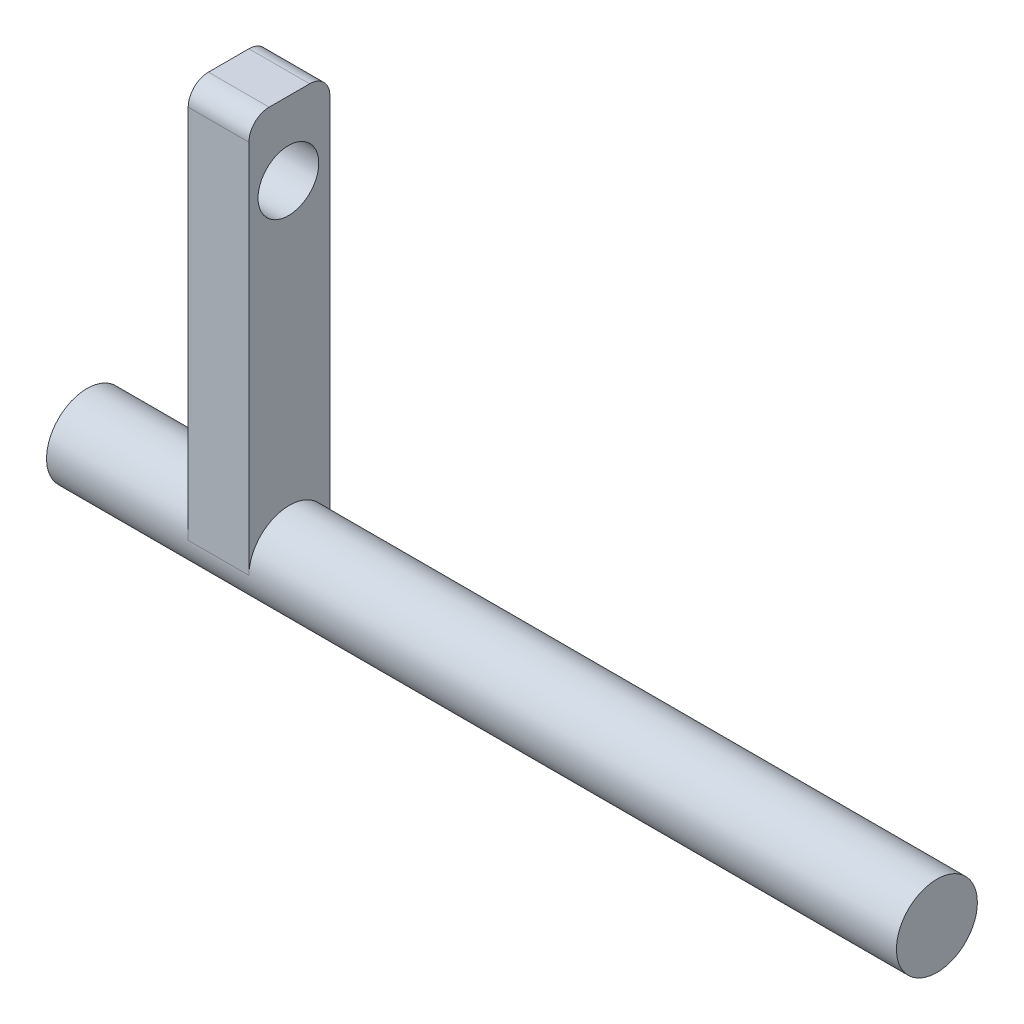
ISO-10303-21;
HEADER;
FILE_DESCRIPTION(('STEP AP214'),'2;1');
FILE_NAME('part.step','',(''),(''),'','','');
FILE_SCHEMA(('AUTOMOTIVE_DESIGN { 1 0 10303 214 1 1 1 1 }'));
ENDSEC;
DATA;
#1=APPLICATION_CONTEXT('core data for automotive mechanical design processes');
#2=APPLICATION_PROTOCOL_DEFINITION('international standard','automotive_design',2000,#1);
#3=PRODUCT_CONTEXT('',#1,'mechanical');
#4=PRODUCT('Part','Part','',(#3));
#5=PRODUCT_RELATED_PRODUCT_CATEGORY('part','',(#4));
#6=PRODUCT_DEFINITION_FORMATION('','',#4);
#7=PRODUCT_DEFINITION_CONTEXT('part definition',#1,'design');
#8=PRODUCT_DEFINITION('design','',#6,#7);
#9=PRODUCT_DEFINITION_SHAPE('','',#8);
#10=(LENGTH_UNIT() NAMED_UNIT(*) SI_UNIT(.MILLI.,.METRE.));
#11=(NAMED_UNIT(*) PLANE_ANGLE_UNIT() SI_UNIT($,.RADIAN.));
#12=(NAMED_UNIT(*) SI_UNIT($,.STERADIAN.) SOLID_ANGLE_UNIT());
#13=UNCERTAINTY_MEASURE_WITH_UNIT(LENGTH_MEASURE(1.E-05),#10,'distance_accuracy_value','');
#14=(GEOMETRIC_REPRESENTATION_CONTEXT(3) GLOBAL_UNCERTAINTY_ASSIGNED_CONTEXT((#13)) GLOBAL_UNIT_ASSIGNED_CONTEXT((#10,
#11,#12)) REPRESENTATION_CONTEXT('',''));
#15=CARTESIAN_POINT('',(0.,0.,0.));
#16=DIRECTION('',(0.,0.,1.));
#17=DIRECTION('',(1.,0.,0.));
#18=AXIS2_PLACEMENT_3D('',#15,#16,#17);
#19=CARTESIAN_POINT('',(10.,7.00051490063158,10.6584652997722));
#20=DIRECTION('',(0.,0.,-1.));
#21=DIRECTION('',(-1.,0.,0.));
#22=AXIS2_PLACEMENT_3D('',#19,#20,#21);
#23=PLANE('',#22);
#24=DIRECTION('',(0.,-1.,0.));
#25=VECTOR('',#24,1.);
#26=CARTESIAN_POINT('',(7.,7.00051490063158,10.6584652997722));
#27=LINE('',#26,#25);
#28=CARTESIAN_POINT('',(7.,25.5383100982032,10.6584652997722));
#29=VERTEX_POINT('',#28);
#30=CARTESIAN_POINT('',(7.,7.00051490063158,10.6584652997722));
#31=VERTEX_POINT('',#30);
#32=EDGE_CURVE('E88',#29,#31,#27,.T.);
#33=ORIENTED_EDGE('',*,*,#32,.F.);
#34=DIRECTION('',(-1.,0.,0.));
#35=VECTOR('',#34,1.);
#36=CARTESIAN_POINT('',(10.,25.5383100982032,10.6584652997722));
#37=LINE('',#36,#35);
#38=CARTESIAN_POINT('',(10.,25.5383100982032,10.6584652997722));
#39=VERTEX_POINT('',#38);
#40=EDGE_CURVE('E48',#29,#39,#37,.F.);
#41=ORIENTED_EDGE('',*,*,#40,.T.);
#42=DIRECTION('',(0.,-1.,0.));
#43=VECTOR('',#42,1.);
#44=CARTESIAN_POINT('',(10.,7.00051490063158,10.6584652997722));
#45=LINE('',#44,#43);
#46=CARTESIAN_POINT('',(10.,7.00051490063158,10.6584652997722));
#47=VERTEX_POINT('',#46);
#48=EDGE_CURVE('E109',#39,#47,#45,.T.);
#49=ORIENTED_EDGE('',*,*,#48,.T.);
#50=DIRECTION('',(-1.,0.,0.));
#51=VECTOR('',#50,1.);
#52=CARTESIAN_POINT('',(10.,7.00051490063158,10.6584652997722));
#53=LINE('',#52,#51);
#54=EDGE_CURVE('E103',#47,#31,#53,.T.);
#55=ORIENTED_EDGE('',*,*,#54,.T.);
#56=EDGE_LOOP('',(#33,#41,#49,#55));
#57=FACE_BOUND('',#56,.T.);
#58=ADVANCED_FACE('F40',(#57),#23,.T.);
#59=CARTESIAN_POINT('',(10.,13.7604693074356,14.6584652997722));
#60=DIRECTION('',(0.,0.,1.));
#61=DIRECTION('',(1.,0.,0.));
#62=AXIS2_PLACEMENT_3D('',#59,#60,#61);
#63=PLANE('',#62);
#64=DIRECTION('',(0.,1.,0.));
#65=VECTOR('',#64,1.);
#66=CARTESIAN_POINT('',(10.,13.7604693074356,14.6584652997722));
#67=LINE('',#66,#65);
#68=CARTESIAN_POINT('',(10.,7.00051490063158,14.6584652997722));
#69=VERTEX_POINT('',#68);
#70=CARTESIAN_POINT('',(10.,25.5383100982032,14.6584652997722));
#71=VERTEX_POINT('',#70);
#72=EDGE_CURVE('E96',#69,#71,#67,.T.);
#73=ORIENTED_EDGE('',*,*,#72,.T.);
#74=DIRECTION('',(1.,0.,0.));
#75=VECTOR('',#74,1.);
#76=CARTESIAN_POINT('',(7.,25.5383100982032,14.6584652997722));
#77=LINE('',#76,#75);
#78=CARTESIAN_POINT('',(7.,25.5383100982032,14.6584652997722));
#79=VERTEX_POINT('',#78);
#80=EDGE_CURVE('E128',#71,#79,#77,.F.);
#81=ORIENTED_EDGE('',*,*,#80,.T.);
#82=DIRECTION('',(0.,1.,0.));
#83=VECTOR('',#82,1.);
#84=CARTESIAN_POINT('',(7.,13.7604693074356,14.6584652997722));
#85=LINE('',#84,#83);
#86=CARTESIAN_POINT('',(7.,7.00051490063158,14.6584652997722));
#87=VERTEX_POINT('',#86);
#88=EDGE_CURVE('E97',#87,#79,#85,.T.);
#89=ORIENTED_EDGE('',*,*,#88,.F.);
#90=DIRECTION('',(-1.,0.,0.));
#91=VECTOR('',#90,1.);
#92=CARTESIAN_POINT('',(10.,7.00051490063158,14.6584652997722));
#93=LINE('',#92,#91);
#94=EDGE_CURVE('E106',#69,#87,#93,.T.);
#95=ORIENTED_EDGE('',*,*,#94,.F.);
#96=EDGE_LOOP('',(#73,#81,#89,#95));
#97=FACE_BOUND('',#96,.T.);
#98=ADVANCED_FACE('F158',(#97),#63,.T.);
#99=CARTESIAN_POINT('',(42.,7.00051490063158,12.6584652997722));
#100=DIRECTION('',(-1.,0.,0.));
#101=DIRECTION('',(0.,0.,1.));
#102=AXIS2_PLACEMENT_3D('',#99,#100,#101);
#103=CYLINDRICAL_SURFACE('',#102,2.);
#104=CARTESIAN_POINT('',(0.,7.00051490063158,12.6584652997722));
#105=DIRECTION('',(1.,0.,0.));
#106=DIRECTION('',(0.,0.,-1.));
#107=AXIS2_PLACEMENT_3D('',#104,#105,#106);
#108=CIRCLE('',#107,2.);
#109=CARTESIAN_POINT('',(0.,7.00051490063158,10.6584652997722));
#110=VERTEX_POINT('',#109);
#111=EDGE_CURVE('E110',#110,#110,#108,.T.);
#112=ORIENTED_EDGE('',*,*,#111,.T.);
#113=EDGE_LOOP('',(#112));
#114=FACE_BOUND('',#113,.T.);
#115=CARTESIAN_POINT('',(42.,7.00051490063158,12.6584652997722));
#116=DIRECTION('',(1.,0.,0.));
#117=DIRECTION('',(0.,0.,-1.));
#118=AXIS2_PLACEMENT_3D('',#115,#116,#117);
#119=CIRCLE('',#118,2.);
#120=CARTESIAN_POINT('',(42.,7.00051490063158,10.6584652997722));
#121=VERTEX_POINT('',#120);
#122=EDGE_CURVE('E113',#121,#121,#119,.T.);
#123=ORIENTED_EDGE('',*,*,#122,.F.);
#124=EDGE_LOOP('',(#123));
#125=FACE_BOUND('',#124,.T.);
#126=CARTESIAN_POINT('',(10.,7.00051490063158,12.6584652997722));
#127=DIRECTION('',(-1.,0.,0.));
#128=DIRECTION('',(0.,0.,1.));
#129=AXIS2_PLACEMENT_3D('',#126,#127,#128);
#130=CIRCLE('',#129,2.);
#131=EDGE_CURVE('E120',#69,#47,#130,.T.);
#132=ORIENTED_EDGE('',*,*,#131,.F.);
#133=ORIENTED_EDGE('',*,*,#94,.T.);
#134=CARTESIAN_POINT('',(7.,7.00051490063158,12.6584652997722));
#135=DIRECTION('',(1.,0.,0.));
#136=DIRECTION('',(0.,0.,1.));
#137=AXIS2_PLACEMENT_3D('',#134,#135,#136);
#138=CIRCLE('',#137,2.);
#139=EDGE_CURVE('E93',#31,#87,#138,.T.);
#140=ORIENTED_EDGE('',*,*,#139,.F.);
#141=ORIENTED_EDGE('',*,*,#54,.F.);
#142=EDGE_LOOP('',(#132,#133,#140,#141));
#143=FACE_BOUND('',#142,.T.);
#144=ADVANCED_FACE('F102',(#114,#125,#143),#103,.T.);
#145=CARTESIAN_POINT('',(42.,7.00051490063158,12.6584652997722));
#146=DIRECTION('',(1.,0.,0.));
#147=DIRECTION('',(0.,0.,-1.));
#148=AXIS2_PLACEMENT_3D('',#145,#146,#147);
#149=PLANE('',#148);
#150=ORIENTED_EDGE('',*,*,#122,.T.);
#151=EDGE_LOOP('',(#150));
#152=FACE_BOUND('',#151,.T.);
#153=ADVANCED_FACE('F177',(#152),#149,.T.);
#154=CARTESIAN_POINT('',(0.,7.00051490063158,12.6584652997722));
#155=DIRECTION('',(1.,0.,0.));
#156=DIRECTION('',(0.,0.,-1.));
#157=AXIS2_PLACEMENT_3D('',#154,#155,#156);
#158=PLANE('',#157);
#159=ORIENTED_EDGE('',*,*,#111,.F.);
#160=EDGE_LOOP('',(#159));
#161=FACE_BOUND('',#160,.T.);
#162=ADVANCED_FACE('F180',(#161),#158,.F.);
#163=CARTESIAN_POINT('',(10.,7.00051490063158,12.6584652997722));
#164=DIRECTION('',(-1.,0.,0.));
#165=DIRECTION('',(0.,0.,1.));
#166=AXIS2_PLACEMENT_3D('',#163,#164,#165);
#167=PLANE('',#166);
#168=CARTESIAN_POINT('',(10.,22.9195459401397,12.7066390891025));
#169=DIRECTION('',(-1.,0.,0.));
#170=DIRECTION('',(0.,0.,1.));
#171=AXIS2_PLACEMENT_3D('',#168,#169,#170);
#172=CIRCLE('',#171,1.5);
#173=CARTESIAN_POINT('',(10.,22.9195459401397,14.2066390891025));
#174=VERTEX_POINT('',#173);
#175=EDGE_CURVE('E107',#174,#174,#172,.T.);
#176=ORIENTED_EDGE('',*,*,#175,.T.);
#177=EDGE_LOOP('',(#176));
#178=FACE_BOUND('',#177,.T.);
#179=ORIENTED_EDGE('',*,*,#48,.F.);
#180=CARTESIAN_POINT('',(10.,25.5383100982032,11.6584652997722));
#181=DIRECTION('',(-1.,0.,0.));
#182=DIRECTION('',(0.,0.,1.));
#183=AXIS2_PLACEMENT_3D('',#180,#181,#182);
#184=CIRCLE('',#183,1.);
#185=CARTESIAN_POINT('',(10.,26.5383100982032,11.6584652997722));
#186=VERTEX_POINT('',#185);
#187=EDGE_CURVE('E11',#39,#186,#184,.F.);
#188=ORIENTED_EDGE('',*,*,#187,.T.);
#189=DIRECTION('',(0.,0.,1.));
#190=VECTOR('',#189,1.);
#191=CARTESIAN_POINT('',(10.,26.5383100982032,12.6584652997722));
#192=LINE('',#191,#190);
#193=CARTESIAN_POINT('',(10.,26.5383100982032,13.6584652997722));
#194=VERTEX_POINT('',#193);
#195=EDGE_CURVE('E141',#186,#194,#192,.T.);
#196=ORIENTED_EDGE('',*,*,#195,.T.);
#197=CARTESIAN_POINT('',(10.,25.5383100982032,13.6584652997722));
#198=DIRECTION('',(-1.,0.,0.));
#199=DIRECTION('',(0.,0.,1.));
#200=AXIS2_PLACEMENT_3D('',#197,#198,#199);
#201=CIRCLE('',#200,1.);
#202=EDGE_CURVE('E126',#194,#71,#201,.F.);
#203=ORIENTED_EDGE('',*,*,#202,.T.);
#204=ORIENTED_EDGE('',*,*,#72,.F.);
#205=ORIENTED_EDGE('',*,*,#131,.T.);
#206=EDGE_LOOP('',(#179,#188,#196,#203,#204,#205));
#207=FACE_BOUND('',#206,.T.);
#208=ADVANCED_FACE('F163',(#178,#207),#167,.F.);
#209=CARTESIAN_POINT('',(7.,7.00051490063158,12.6584652997722));
#210=DIRECTION('',(-1.,0.,0.));
#211=DIRECTION('',(0.,0.,1.));
#212=AXIS2_PLACEMENT_3D('',#209,#210,#211);
#213=PLANE('',#212);
#214=DIRECTION('',(0.,0.,1.));
#215=VECTOR('',#214,1.);
#216=CARTESIAN_POINT('',(7.,26.5383100982032,18.5417958890789));
#217=LINE('',#216,#215);
#218=CARTESIAN_POINT('',(7.,26.5383100982032,11.6584652997722));
#219=VERTEX_POINT('',#218);
#220=CARTESIAN_POINT('',(7.,26.5383100982032,13.6584652997722));
#221=VERTEX_POINT('',#220);
#222=EDGE_CURVE('E140',#219,#221,#217,.T.);
#223=ORIENTED_EDGE('',*,*,#222,.F.);
#224=CARTESIAN_POINT('',(7.,25.5383100982032,11.6584652997722));
#225=DIRECTION('',(-1.,0.,0.));
#226=DIRECTION('',(0.,0.,1.));
#227=AXIS2_PLACEMENT_3D('',#224,#225,#226);
#228=CIRCLE('',#227,1.);
#229=EDGE_CURVE('E62',#219,#29,#228,.T.);
#230=ORIENTED_EDGE('',*,*,#229,.T.);
#231=ORIENTED_EDGE('',*,*,#32,.T.);
#232=ORIENTED_EDGE('',*,*,#139,.T.);
#233=ORIENTED_EDGE('',*,*,#88,.T.);
#234=CARTESIAN_POINT('',(7.,25.5383100982032,13.6584652997722));
#235=DIRECTION('',(-1.,0.,0.));
#236=DIRECTION('',(0.,0.,1.));
#237=AXIS2_PLACEMENT_3D('',#234,#235,#236);
#238=CIRCLE('',#237,1.);
#239=EDGE_CURVE('E130',#79,#221,#238,.T.);
#240=ORIENTED_EDGE('',*,*,#239,.T.);
#241=EDGE_LOOP('',(#223,#230,#231,#232,#233,#240));
#242=FACE_BOUND('',#241,.T.);
#243=CARTESIAN_POINT('',(7.,22.9195459401397,12.7066390891025));
#244=DIRECTION('',(-1.,0.,0.));
#245=DIRECTION('',(0.,0.,1.));
#246=AXIS2_PLACEMENT_3D('',#243,#244,#245);
#247=CIRCLE('',#246,1.5);
#248=CARTESIAN_POINT('',(7.,22.9195459401397,14.2066390891025));
#249=VERTEX_POINT('',#248);
#250=EDGE_CURVE('E147',#249,#249,#247,.T.);
#251=ORIENTED_EDGE('',*,*,#250,.F.);
#252=EDGE_LOOP('',(#251));
#253=FACE_BOUND('',#252,.T.);
#254=ADVANCED_FACE('F90',(#242,#253),#213,.T.);
#255=CARTESIAN_POINT('',(42.,22.9195459401397,12.7066390891025));
#256=DIRECTION('',(-1.,0.,0.));
#257=DIRECTION('',(0.,0.,1.));
#258=AXIS2_PLACEMENT_3D('',#255,#256,#257);
#259=CYLINDRICAL_SURFACE('',#258,1.5);
#260=ORIENTED_EDGE('',*,*,#250,.T.);
#261=EDGE_LOOP('',(#260));
#262=FACE_BOUND('',#261,.T.);
#263=ORIENTED_EDGE('',*,*,#175,.F.);
#264=EDGE_LOOP('',(#263));
#265=FACE_BOUND('',#264,.T.);
#266=ADVANCED_FACE('F215',(#262,#265),#259,.F.);
#267=CARTESIAN_POINT('',(42.,26.5383100982032,18.5417958890789));
#268=DIRECTION('',(0.,-1.,0.));
#269=DIRECTION('',(0.,0.,-1.));
#270=AXIS2_PLACEMENT_3D('',#267,#268,#269);
#271=PLANE('',#270);
#272=ORIENTED_EDGE('',*,*,#195,.F.);
#273=DIRECTION('',(-1.,0.,0.));
#274=VECTOR('',#273,1.);
#275=CARTESIAN_POINT('',(7.,26.5383100982032,11.6584652997722));
#276=LINE('',#275,#274);
#277=EDGE_CURVE('E133',#186,#219,#276,.T.);
#278=ORIENTED_EDGE('',*,*,#277,.T.);
#279=ORIENTED_EDGE('',*,*,#222,.T.);
#280=DIRECTION('',(1.,0.,0.));
#281=VECTOR('',#280,1.);
#282=CARTESIAN_POINT('',(10.,26.5383100982032,13.6584652997722));
#283=LINE('',#282,#281);
#284=EDGE_CURVE('E123',#221,#194,#283,.T.);
#285=ORIENTED_EDGE('',*,*,#284,.T.);
#286=EDGE_LOOP('',(#272,#278,#279,#285));
#287=FACE_BOUND('',#286,.T.);
#288=ADVANCED_FACE('F139',(#287),#271,.F.);
#289=CARTESIAN_POINT('',(42.,25.5383100982032,13.6584652997722));
#290=DIRECTION('',(-1.,0.,0.));
#291=DIRECTION('',(0.,0.,1.));
#292=AXIS2_PLACEMENT_3D('',#289,#290,#291);
#293=CYLINDRICAL_SURFACE('',#292,1.);
#294=ORIENTED_EDGE('',*,*,#239,.F.);
#295=ORIENTED_EDGE('',*,*,#80,.F.);
#296=ORIENTED_EDGE('',*,*,#202,.F.);
#297=ORIENTED_EDGE('',*,*,#284,.F.);
#298=EDGE_LOOP('',(#294,#295,#296,#297));
#299=FACE_BOUND('',#298,.T.);
#300=ADVANCED_FACE('F162',(#299),#293,.T.);
#301=CARTESIAN_POINT('',(42.,25.5383100982032,11.6584652997722));
#302=DIRECTION('',(1.,0.,0.));
#303=DIRECTION('',(0.,0.,-1.));
#304=AXIS2_PLACEMENT_3D('',#301,#302,#303);
#305=CYLINDRICAL_SURFACE('',#304,1.);
#306=ORIENTED_EDGE('',*,*,#187,.F.);
#307=ORIENTED_EDGE('',*,*,#40,.F.);
#308=ORIENTED_EDGE('',*,*,#229,.F.);
#309=ORIENTED_EDGE('',*,*,#277,.F.);
#310=EDGE_LOOP('',(#306,#307,#308,#309));
#311=FACE_BOUND('',#310,.T.);
#312=ADVANCED_FACE('F42',(#311),#305,.T.);
#313=CLOSED_SHELL('',(#58,#98,#144,#153,#162,#208,#254,#266,#288,#300,#312));
#314=MANIFOLD_SOLID_BREP('B2',#313);
#315=ADVANCED_BREP_SHAPE_REPRESENTATION('',(#18,#314),#14);
#316=SHAPE_DEFINITION_REPRESENTATION(#9,#315);
ENDSEC;
END-ISO-10303-21;
